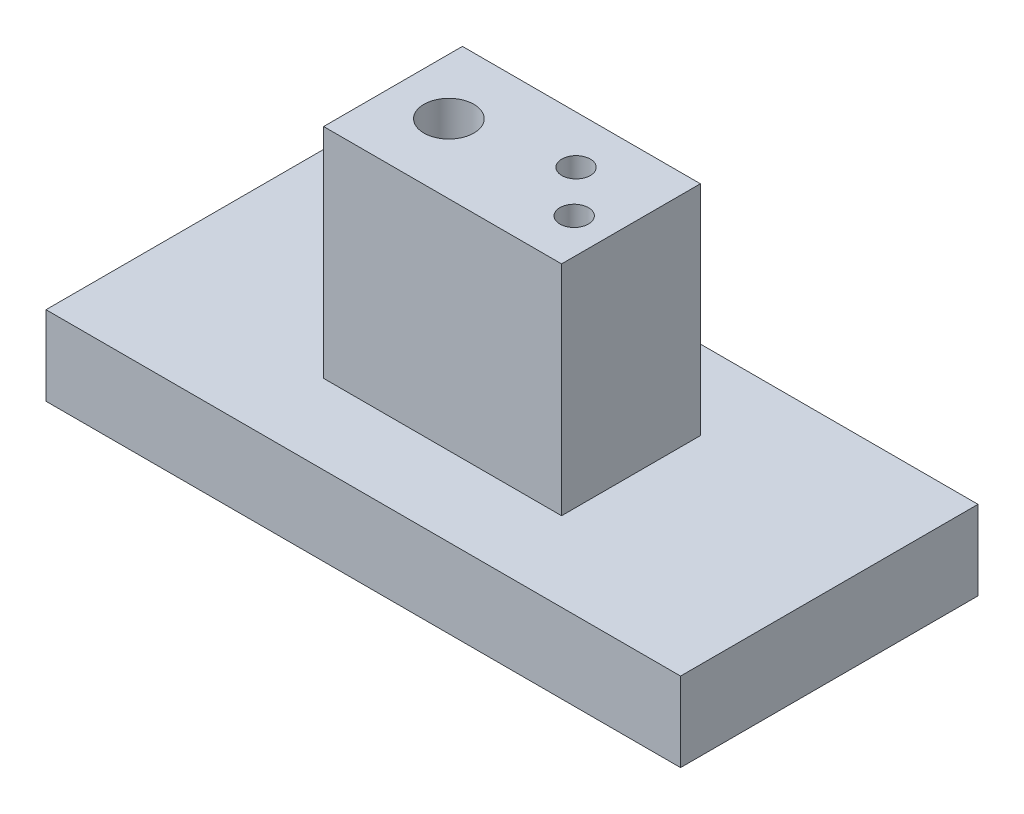
ISO-10303-21;
HEADER;
FILE_DESCRIPTION(('STEP AP214'),'2;1');
FILE_NAME('part.step','',(''),(''),'','','');
FILE_SCHEMA(('AUTOMOTIVE_DESIGN { 1 0 10303 214 1 1 1 1 }'));
ENDSEC;
DATA;
#1=APPLICATION_CONTEXT('core data for automotive mechanical design processes');
#2=APPLICATION_PROTOCOL_DEFINITION('international standard','automotive_design',2000,#1);
#3=PRODUCT_CONTEXT('',#1,'mechanical');
#4=PRODUCT('Part','Part','',(#3));
#5=PRODUCT_RELATED_PRODUCT_CATEGORY('part','',(#4));
#6=PRODUCT_DEFINITION_FORMATION('','',#4);
#7=PRODUCT_DEFINITION_CONTEXT('part definition',#1,'design');
#8=PRODUCT_DEFINITION('design','',#6,#7);
#9=PRODUCT_DEFINITION_SHAPE('','',#8);
#10=(LENGTH_UNIT() NAMED_UNIT(*) SI_UNIT(.MILLI.,.METRE.));
#11=(NAMED_UNIT(*) PLANE_ANGLE_UNIT() SI_UNIT($,.RADIAN.));
#12=(NAMED_UNIT(*) SI_UNIT($,.STERADIAN.) SOLID_ANGLE_UNIT());
#13=UNCERTAINTY_MEASURE_WITH_UNIT(LENGTH_MEASURE(1.E-05),#10,'distance_accuracy_value','');
#14=(GEOMETRIC_REPRESENTATION_CONTEXT(3) GLOBAL_UNCERTAINTY_ASSIGNED_CONTEXT((#13)) GLOBAL_UNIT_ASSIGNED_CONTEXT((#10,
#11,#12)) REPRESENTATION_CONTEXT('',''));
#15=CARTESIAN_POINT('',(0.,0.,0.));
#16=DIRECTION('',(0.,0.,1.));
#17=DIRECTION('',(1.,0.,0.));
#18=AXIS2_PLACEMENT_3D('',#15,#16,#17);
#19=CARTESIAN_POINT('',(0.,5.5,0.));
#20=DIRECTION('',(0.,-1.,0.));
#21=DIRECTION('',(0.,0.,-1.));
#22=AXIS2_PLACEMENT_3D('',#19,#20,#21);
#23=PLANE('',#22);
#24=DIRECTION('',(0.,0.,1.));
#25=VECTOR('',#24,1.);
#26=CARTESIAN_POINT('',(-3.,5.5,1.75));
#27=LINE('',#26,#25);
#28=CARTESIAN_POINT('',(-3.,5.5,-1.75));
#29=VERTEX_POINT('',#28);
#30=CARTESIAN_POINT('',(-3.,5.5,1.75));
#31=VERTEX_POINT('',#30);
#32=EDGE_CURVE('E141',#29,#31,#27,.T.);
#33=ORIENTED_EDGE('',*,*,#32,.T.);
#34=DIRECTION('',(1.,0.,0.));
#35=VECTOR('',#34,1.);
#36=CARTESIAN_POINT('',(-3.,5.5,1.75));
#37=LINE('',#36,#35);
#38=CARTESIAN_POINT('',(3.,5.5,1.75));
#39=VERTEX_POINT('',#38);
#40=EDGE_CURVE('E143',#31,#39,#37,.T.);
#41=ORIENTED_EDGE('',*,*,#40,.T.);
#42=DIRECTION('',(0.,0.,-1.));
#43=VECTOR('',#42,1.);
#44=CARTESIAN_POINT('',(3.,5.5,1.75));
#45=LINE('',#44,#43);
#46=CARTESIAN_POINT('',(3.,5.5,-1.75));
#47=VERTEX_POINT('',#46);
#48=EDGE_CURVE('E146',#39,#47,#45,.T.);
#49=ORIENTED_EDGE('',*,*,#48,.T.);
#50=DIRECTION('',(-1.,0.,0.));
#51=VECTOR('',#50,1.);
#52=CARTESIAN_POINT('',(-3.,5.5,-1.75));
#53=LINE('',#52,#51);
#54=EDGE_CURVE('E49',#47,#29,#53,.T.);
#55=ORIENTED_EDGE('',*,*,#54,.T.);
#56=EDGE_LOOP('',(#33,#41,#49,#55));
#57=FACE_BOUND('',#56,.T.);
#58=CARTESIAN_POINT('',(1.07296606180843,5.5,-0.541981392860775));
#59=DIRECTION('',(0.,1.,0.));
#60=DIRECTION('',(0.,0.,1.));
#61=AXIS2_PLACEMENT_3D('',#58,#59,#60);
#62=CIRCLE('',#61,0.36);
#63=CARTESIAN_POINT('',(1.07296606180843,5.5,-0.181981392860775));
#64=VERTEX_POINT('',#63);
#65=EDGE_CURVE('E135',#64,#64,#62,.T.);
#66=ORIENTED_EDGE('',*,*,#65,.F.);
#67=EDGE_LOOP('',(#66));
#68=FACE_BOUND('',#67,.T.);
#69=CARTESIAN_POINT('',(2.10980003075948,5.5,0.541981392860773));
#70=DIRECTION('',(0.,1.,0.));
#71=DIRECTION('',(0.,0.,1.));
#72=AXIS2_PLACEMENT_3D('',#69,#70,#71);
#73=CIRCLE('',#72,0.36);
#74=CARTESIAN_POINT('',(2.10980003075948,5.5,0.901981392860773));
#75=VERTEX_POINT('',#74);
#76=EDGE_CURVE('E129',#75,#75,#73,.T.);
#77=ORIENTED_EDGE('',*,*,#76,.F.);
#78=EDGE_LOOP('',(#77));
#79=FACE_BOUND('',#78,.T.);
#80=CARTESIAN_POINT('',(-1.59138304628396,5.5,0.));
#81=DIRECTION('',(0.,1.,0.));
#82=DIRECTION('',(0.,0.,1.));
#83=AXIS2_PLACEMENT_3D('',#80,#81,#82);
#84=CIRCLE('',#83,0.63);
#85=CARTESIAN_POINT('',(-1.59138304628396,5.5,0.63));
#86=VERTEX_POINT('',#85);
#87=EDGE_CURVE('E120',#86,#86,#84,.T.);
#88=ORIENTED_EDGE('',*,*,#87,.F.);
#89=EDGE_LOOP('',(#88));
#90=FACE_BOUND('',#89,.T.);
#91=ADVANCED_FACE('F33',(#57,#68,#79,#90),#23,.F.);
#92=CARTESIAN_POINT('',(-3.,5.5,1.75));
#93=DIRECTION('',(1.,0.,0.));
#94=DIRECTION('',(0.,0.,-1.));
#95=AXIS2_PLACEMENT_3D('',#92,#93,#94);
#96=PLANE('',#95);
#97=DIRECTION('',(0.,0.,1.));
#98=VECTOR('',#97,1.);
#99=CARTESIAN_POINT('',(-3.,0.,1.75));
#100=LINE('',#99,#98);
#101=CARTESIAN_POINT('',(-3.,0.,-1.75));
#102=VERTEX_POINT('',#101);
#103=CARTESIAN_POINT('',(-3.,0.,1.75));
#104=VERTEX_POINT('',#103);
#105=EDGE_CURVE('E138',#102,#104,#100,.T.);
#106=ORIENTED_EDGE('',*,*,#105,.T.);
#107=DIRECTION('',(0.,-1.,0.));
#108=VECTOR('',#107,1.);
#109=CARTESIAN_POINT('',(-3.,5.5,1.75));
#110=LINE('',#109,#108);
#111=EDGE_CURVE('E42',#31,#104,#110,.T.);
#112=ORIENTED_EDGE('',*,*,#111,.F.);
#113=ORIENTED_EDGE('',*,*,#32,.F.);
#114=DIRECTION('',(0.,-1.,0.));
#115=VECTOR('',#114,1.);
#116=CARTESIAN_POINT('',(-3.,5.5,-1.75));
#117=LINE('',#116,#115);
#118=EDGE_CURVE('E149',#29,#102,#117,.T.);
#119=ORIENTED_EDGE('',*,*,#118,.T.);
#120=EDGE_LOOP('',(#106,#112,#113,#119));
#121=FACE_BOUND('',#120,.T.);
#122=ADVANCED_FACE('F35',(#121),#96,.F.);
#123=CARTESIAN_POINT('',(-3.,5.5,1.75));
#124=DIRECTION('',(0.,0.,-1.));
#125=DIRECTION('',(-1.,0.,0.));
#126=AXIS2_PLACEMENT_3D('',#123,#124,#125);
#127=PLANE('',#126);
#128=DIRECTION('',(1.,0.,0.));
#129=VECTOR('',#128,1.);
#130=CARTESIAN_POINT('',(-3.,0.,1.75));
#131=LINE('',#130,#129);
#132=CARTESIAN_POINT('',(3.,0.,1.75));
#133=VERTEX_POINT('',#132);
#134=EDGE_CURVE('E152',#104,#133,#131,.T.);
#135=ORIENTED_EDGE('',*,*,#134,.T.);
#136=DIRECTION('',(0.,-1.,0.));
#137=VECTOR('',#136,1.);
#138=CARTESIAN_POINT('',(3.,5.5,1.75));
#139=LINE('',#138,#137);
#140=EDGE_CURVE('E165',#39,#133,#139,.T.);
#141=ORIENTED_EDGE('',*,*,#140,.F.);
#142=ORIENTED_EDGE('',*,*,#40,.F.);
#143=ORIENTED_EDGE('',*,*,#111,.T.);
#144=EDGE_LOOP('',(#135,#141,#142,#143));
#145=FACE_BOUND('',#144,.T.);
#146=ADVANCED_FACE('F170',(#145),#127,.F.);
#147=CARTESIAN_POINT('',(3.,5.5,1.75));
#148=DIRECTION('',(-1.,0.,0.));
#149=DIRECTION('',(0.,0.,1.));
#150=AXIS2_PLACEMENT_3D('',#147,#148,#149);
#151=PLANE('',#150);
#152=DIRECTION('',(0.,0.,-1.));
#153=VECTOR('',#152,1.);
#154=CARTESIAN_POINT('',(3.,0.,1.75));
#155=LINE('',#154,#153);
#156=CARTESIAN_POINT('',(3.,0.,-1.75));
#157=VERTEX_POINT('',#156);
#158=EDGE_CURVE('E155',#133,#157,#155,.T.);
#159=ORIENTED_EDGE('',*,*,#158,.T.);
#160=DIRECTION('',(0.,-1.,0.));
#161=VECTOR('',#160,1.);
#162=CARTESIAN_POINT('',(3.,5.5,-1.75));
#163=LINE('',#162,#161);
#164=EDGE_CURVE('E162',#47,#157,#163,.T.);
#165=ORIENTED_EDGE('',*,*,#164,.F.);
#166=ORIENTED_EDGE('',*,*,#48,.F.);
#167=ORIENTED_EDGE('',*,*,#140,.T.);
#168=EDGE_LOOP('',(#159,#165,#166,#167));
#169=FACE_BOUND('',#168,.T.);
#170=ADVANCED_FACE('F183',(#169),#151,.F.);
#171=CARTESIAN_POINT('',(-3.,5.5,-1.75));
#172=DIRECTION('',(0.,0.,1.));
#173=DIRECTION('',(1.,0.,0.));
#174=AXIS2_PLACEMENT_3D('',#171,#172,#173);
#175=PLANE('',#174);
#176=DIRECTION('',(-1.,0.,0.));
#177=VECTOR('',#176,1.);
#178=CARTESIAN_POINT('',(-3.,0.,-1.75));
#179=LINE('',#178,#177);
#180=EDGE_CURVE('E144',#157,#102,#179,.T.);
#181=ORIENTED_EDGE('',*,*,#180,.T.);
#182=ORIENTED_EDGE('',*,*,#118,.F.);
#183=ORIENTED_EDGE('',*,*,#54,.F.);
#184=ORIENTED_EDGE('',*,*,#164,.T.);
#185=EDGE_LOOP('',(#181,#182,#183,#184));
#186=FACE_BOUND('',#185,.T.);
#187=ADVANCED_FACE('F179',(#186),#175,.F.);
#188=CARTESIAN_POINT('',(1.07296606180843,5.5,-0.541981392860775));
#189=DIRECTION('',(0.,-1.,0.));
#190=DIRECTION('',(0.,0.,-1.));
#191=AXIS2_PLACEMENT_3D('',#188,#189,#190);
#192=CYLINDRICAL_SURFACE('',#191,0.36);
#193=ORIENTED_EDGE('',*,*,#65,.T.);
#194=EDGE_LOOP('',(#193));
#195=FACE_BOUND('',#194,.T.);
#196=CARTESIAN_POINT('',(1.07296606180843,0.,-0.541981392860775));
#197=DIRECTION('',(0.,1.,0.));
#198=DIRECTION('',(0.,0.,1.));
#199=AXIS2_PLACEMENT_3D('',#196,#197,#198);
#200=CIRCLE('',#199,0.36);
#201=CARTESIAN_POINT('',(1.07296606180843,0.,-0.181981392860775));
#202=VERTEX_POINT('',#201);
#203=EDGE_CURVE('E132',#202,#202,#200,.T.);
#204=ORIENTED_EDGE('',*,*,#203,.F.);
#205=EDGE_LOOP('',(#204));
#206=FACE_BOUND('',#205,.T.);
#207=ADVANCED_FACE('F206',(#195,#206),#192,.F.);
#208=CARTESIAN_POINT('',(2.10980003075948,5.5,0.541981392860773));
#209=DIRECTION('',(0.,-1.,0.));
#210=DIRECTION('',(0.,0.,-1.));
#211=AXIS2_PLACEMENT_3D('',#208,#209,#210);
#212=CYLINDRICAL_SURFACE('',#211,0.36);
#213=ORIENTED_EDGE('',*,*,#76,.T.);
#214=EDGE_LOOP('',(#213));
#215=FACE_BOUND('',#214,.T.);
#216=CARTESIAN_POINT('',(2.10980003075948,0.,0.541981392860773));
#217=DIRECTION('',(0.,1.,0.));
#218=DIRECTION('',(0.,0.,1.));
#219=AXIS2_PLACEMENT_3D('',#216,#217,#218);
#220=CIRCLE('',#219,0.36);
#221=CARTESIAN_POINT('',(2.10980003075948,0.,0.901981392860773));
#222=VERTEX_POINT('',#221);
#223=EDGE_CURVE('E123',#222,#222,#220,.T.);
#224=ORIENTED_EDGE('',*,*,#223,.F.);
#225=EDGE_LOOP('',(#224));
#226=FACE_BOUND('',#225,.T.);
#227=ADVANCED_FACE('F196',(#215,#226),#212,.F.);
#228=CARTESIAN_POINT('',(-1.59138304628396,5.5,0.));
#229=DIRECTION('',(0.,-1.,0.));
#230=DIRECTION('',(0.,0.,-1.));
#231=AXIS2_PLACEMENT_3D('',#228,#229,#230);
#232=CYLINDRICAL_SURFACE('',#231,0.63);
#233=CARTESIAN_POINT('',(-1.59138304628396,0.2,0.));
#234=DIRECTION('',(0.,1.,0.));
#235=DIRECTION('',(0.,0.,1.));
#236=AXIS2_PLACEMENT_3D('',#233,#234,#235);
#237=CIRCLE('',#236,0.63);
#238=CARTESIAN_POINT('',(-1.59138304628396,0.2,0.63));
#239=VERTEX_POINT('',#238);
#240=EDGE_CURVE('E11',#239,#239,#237,.T.);
#241=ORIENTED_EDGE('',*,*,#240,.F.);
#242=EDGE_LOOP('',(#241));
#243=FACE_BOUND('',#242,.T.);
#244=ORIENTED_EDGE('',*,*,#87,.T.);
#245=EDGE_LOOP('',(#244));
#246=FACE_BOUND('',#245,.T.);
#247=ADVANCED_FACE('F193',(#243,#246),#232,.F.);
#248=CARTESIAN_POINT('',(0.,0.,0.));
#249=DIRECTION('',(0.,-1.,0.));
#250=DIRECTION('',(0.,0.,-1.));
#251=AXIS2_PLACEMENT_3D('',#248,#249,#250);
#252=PLANE('',#251);
#253=CARTESIAN_POINT('',(2.10980003075948,0.,0.541981392860773));
#254=DIRECTION('',(0.,-1.,0.));
#255=DIRECTION('',(0.,0.,-1.));
#256=AXIS2_PLACEMENT_3D('',#253,#254,#255);
#257=CIRCLE('',#256,0.25);
#258=CARTESIAN_POINT('',(2.10980003075948,0.,0.291981392860773));
#259=VERTEX_POINT('',#258);
#260=EDGE_CURVE('E372',#259,#259,#257,.T.);
#261=ORIENTED_EDGE('',*,*,#260,.T.);
#262=EDGE_LOOP('',(#261));
#263=FACE_BOUND('',#262,.T.);
#264=ORIENTED_EDGE('',*,*,#223,.T.);
#265=EDGE_LOOP('',(#264));
#266=FACE_BOUND('',#265,.T.);
#267=ADVANCED_FACE('F195',(#263,#266),#252,.F.);
#268=CARTESIAN_POINT('',(1.07296606180843,0.,-0.541981392860775));
#269=DIRECTION('',(0.,-1.,0.));
#270=DIRECTION('',(0.,0.,-1.));
#271=AXIS2_PLACEMENT_3D('',#268,#269,#270);
#272=CIRCLE('',#271,0.25);
#273=CARTESIAN_POINT('',(1.07296606180843,0.,-0.791981392860775));
#274=VERTEX_POINT('',#273);
#275=EDGE_CURVE('E366',#274,#274,#272,.T.);
#276=ORIENTED_EDGE('',*,*,#275,.T.);
#277=EDGE_LOOP('',(#276));
#278=FACE_BOUND('',#277,.T.);
#279=ORIENTED_EDGE('',*,*,#203,.T.);
#280=EDGE_LOOP('',(#279));
#281=FACE_BOUND('',#280,.T.);
#282=ADVANCED_FACE('F203',(#278,#281),#252,.F.);
#283=CARTESIAN_POINT('',(0.,-2.,0.));
#284=DIRECTION('',(0.,-1.,0.));
#285=DIRECTION('',(0.,0.,-1.));
#286=AXIS2_PLACEMENT_3D('',#283,#284,#285);
#287=PLANE('',#286);
#288=CARTESIAN_POINT('',(1.07296606180843,-2.,-0.541981392860775));
#289=DIRECTION('',(0.,-1.,0.));
#290=DIRECTION('',(0.,0.,-1.));
#291=AXIS2_PLACEMENT_3D('',#288,#289,#290);
#292=CIRCLE('',#291,0.25);
#293=CARTESIAN_POINT('',(1.07296606180843,-2.,-0.791981392860775));
#294=VERTEX_POINT('',#293);
#295=EDGE_CURVE('E369',#294,#294,#292,.T.);
#296=ORIENTED_EDGE('',*,*,#295,.F.);
#297=EDGE_LOOP('',(#296));
#298=FACE_BOUND('',#297,.T.);
#299=DIRECTION('',(0.,0.,-1.));
#300=VECTOR('',#299,1.);
#301=CARTESIAN_POINT('',(-8.,-2.,3.75));
#302=LINE('',#301,#300);
#303=CARTESIAN_POINT('',(-8.,-2.,3.75));
#304=VERTEX_POINT('',#303);
#305=CARTESIAN_POINT('',(-8.,-2.,-3.75));
#306=VERTEX_POINT('',#305);
#307=EDGE_CURVE('E105',#304,#306,#302,.T.);
#308=ORIENTED_EDGE('',*,*,#307,.T.);
#309=DIRECTION('',(1.,0.,0.));
#310=VECTOR('',#309,1.);
#311=CARTESIAN_POINT('',(-8.,-2.,-3.75));
#312=LINE('',#311,#310);
#313=CARTESIAN_POINT('',(8.,-2.,-3.75));
#314=VERTEX_POINT('',#313);
#315=EDGE_CURVE('E94',#306,#314,#312,.T.);
#316=ORIENTED_EDGE('',*,*,#315,.T.);
#317=DIRECTION('',(0.,0.,1.));
#318=VECTOR('',#317,1.);
#319=CARTESIAN_POINT('',(8.,-2.,3.75));
#320=LINE('',#319,#318);
#321=CARTESIAN_POINT('',(8.,-2.,3.75));
#322=VERTEX_POINT('',#321);
#323=EDGE_CURVE('E104',#314,#322,#320,.T.);
#324=ORIENTED_EDGE('',*,*,#323,.T.);
#325=DIRECTION('',(-1.,0.,0.));
#326=VECTOR('',#325,1.);
#327=CARTESIAN_POINT('',(-8.,-2.,3.75));
#328=LINE('',#327,#326);
#329=EDGE_CURVE('E111',#322,#304,#328,.T.);
#330=ORIENTED_EDGE('',*,*,#329,.T.);
#331=EDGE_LOOP('',(#308,#316,#324,#330));
#332=FACE_BOUND('',#331,.T.);
#333=CARTESIAN_POINT('',(2.10980003075948,-2.,0.541981392860773));
#334=DIRECTION('',(0.,-1.,0.));
#335=DIRECTION('',(0.,0.,-1.));
#336=AXIS2_PLACEMENT_3D('',#333,#334,#335);
#337=CIRCLE('',#336,0.25);
#338=CARTESIAN_POINT('',(2.10980003075948,-2.,0.291981392860773));
#339=VERTEX_POINT('',#338);
#340=EDGE_CURVE('E375',#339,#339,#337,.T.);
#341=ORIENTED_EDGE('',*,*,#340,.F.);
#342=EDGE_LOOP('',(#341));
#343=FACE_BOUND('',#342,.T.);
#344=CARTESIAN_POINT('',(-1.59138304628396,-2.,0.));
#345=DIRECTION('',(0.,-1.,0.));
#346=DIRECTION('',(0.,0.,-1.));
#347=AXIS2_PLACEMENT_3D('',#344,#345,#346);
#348=CIRCLE('',#347,0.25);
#349=CARTESIAN_POINT('',(-1.59138304628396,-2.,-0.25));
#350=VERTEX_POINT('',#349);
#351=EDGE_CURVE('E363',#350,#350,#348,.T.);
#352=ORIENTED_EDGE('',*,*,#351,.F.);
#353=EDGE_LOOP('',(#352));
#354=FACE_BOUND('',#353,.T.);
#355=ADVANCED_FACE('F108',(#298,#332,#343,#354),#287,.T.);
#356=ORIENTED_EDGE('',*,*,#105,.F.);
#357=ORIENTED_EDGE('',*,*,#180,.F.);
#358=ORIENTED_EDGE('',*,*,#158,.F.);
#359=ORIENTED_EDGE('',*,*,#134,.F.);
#360=EDGE_LOOP('',(#356,#357,#358,#359));
#361=FACE_BOUND('',#360,.T.);
#362=DIRECTION('',(0.,0.,-1.));
#363=VECTOR('',#362,1.);
#364=CARTESIAN_POINT('',(-8.,0.,3.75));
#365=LINE('',#364,#363);
#366=CARTESIAN_POINT('',(-8.,0.,3.75));
#367=VERTEX_POINT('',#366);
#368=CARTESIAN_POINT('',(-8.,0.,-3.75));
#369=VERTEX_POINT('',#368);
#370=EDGE_CURVE('E119',#367,#369,#365,.T.);
#371=ORIENTED_EDGE('',*,*,#370,.F.);
#372=DIRECTION('',(-1.,0.,0.));
#373=VECTOR('',#372,1.);
#374=CARTESIAN_POINT('',(-8.,0.,3.75));
#375=LINE('',#374,#373);
#376=CARTESIAN_POINT('',(8.,0.,3.75));
#377=VERTEX_POINT('',#376);
#378=EDGE_CURVE('E115',#377,#367,#375,.T.);
#379=ORIENTED_EDGE('',*,*,#378,.F.);
#380=DIRECTION('',(0.,0.,1.));
#381=VECTOR('',#380,1.);
#382=CARTESIAN_POINT('',(8.,0.,3.75));
#383=LINE('',#382,#381);
#384=CARTESIAN_POINT('',(8.,0.,-3.75));
#385=VERTEX_POINT('',#384);
#386=EDGE_CURVE('E386',#385,#377,#383,.T.);
#387=ORIENTED_EDGE('',*,*,#386,.F.);
#388=DIRECTION('',(1.,0.,0.));
#389=VECTOR('',#388,1.);
#390=CARTESIAN_POINT('',(-8.,0.,-3.75));
#391=LINE('',#390,#389);
#392=EDGE_CURVE('E384',#369,#385,#391,.T.);
#393=ORIENTED_EDGE('',*,*,#392,.F.);
#394=EDGE_LOOP('',(#371,#379,#387,#393));
#395=FACE_BOUND('',#394,.T.);
#396=ADVANCED_FACE('F175',(#361,#395),#252,.F.);
#397=CARTESIAN_POINT('',(-8.,-2.,3.75));
#398=DIRECTION('',(1.,0.,0.));
#399=DIRECTION('',(0.,0.,-1.));
#400=AXIS2_PLACEMENT_3D('',#397,#398,#399);
#401=PLANE('',#400);
#402=ORIENTED_EDGE('',*,*,#370,.T.);
#403=DIRECTION('',(0.,1.,0.));
#404=VECTOR('',#403,1.);
#405=CARTESIAN_POINT('',(-8.,-2.,-3.75));
#406=LINE('',#405,#404);
#407=EDGE_CURVE('E98',#306,#369,#406,.T.);
#408=ORIENTED_EDGE('',*,*,#407,.F.);
#409=ORIENTED_EDGE('',*,*,#307,.F.);
#410=DIRECTION('',(0.,1.,0.));
#411=VECTOR('',#410,1.);
#412=CARTESIAN_POINT('',(-8.,-2.,3.75));
#413=LINE('',#412,#411);
#414=EDGE_CURVE('E382',#304,#367,#413,.T.);
#415=ORIENTED_EDGE('',*,*,#414,.T.);
#416=EDGE_LOOP('',(#402,#408,#409,#415));
#417=FACE_BOUND('',#416,.T.);
#418=ADVANCED_FACE('F117',(#417),#401,.F.);
#419=CARTESIAN_POINT('',(-8.,-2.,-3.75));
#420=DIRECTION('',(0.,0.,1.));
#421=DIRECTION('',(1.,0.,0.));
#422=AXIS2_PLACEMENT_3D('',#419,#420,#421);
#423=PLANE('',#422);
#424=ORIENTED_EDGE('',*,*,#392,.T.);
#425=DIRECTION('',(0.,1.,0.));
#426=VECTOR('',#425,1.);
#427=CARTESIAN_POINT('',(8.,-2.,-3.75));
#428=LINE('',#427,#426);
#429=EDGE_CURVE('E101',#314,#385,#428,.T.);
#430=ORIENTED_EDGE('',*,*,#429,.F.);
#431=ORIENTED_EDGE('',*,*,#315,.F.);
#432=ORIENTED_EDGE('',*,*,#407,.T.);
#433=EDGE_LOOP('',(#424,#430,#431,#432));
#434=FACE_BOUND('',#433,.T.);
#435=ADVANCED_FACE('F96',(#434),#423,.F.);
#436=CARTESIAN_POINT('',(8.,-2.,3.75));
#437=DIRECTION('',(-1.,0.,0.));
#438=DIRECTION('',(0.,0.,1.));
#439=AXIS2_PLACEMENT_3D('',#436,#437,#438);
#440=PLANE('',#439);
#441=ORIENTED_EDGE('',*,*,#386,.T.);
#442=DIRECTION('',(0.,1.,0.));
#443=VECTOR('',#442,1.);
#444=CARTESIAN_POINT('',(8.,-2.,3.75));
#445=LINE('',#444,#443);
#446=EDGE_CURVE('E125',#322,#377,#445,.T.);
#447=ORIENTED_EDGE('',*,*,#446,.F.);
#448=ORIENTED_EDGE('',*,*,#323,.F.);
#449=ORIENTED_EDGE('',*,*,#429,.T.);
#450=EDGE_LOOP('',(#441,#447,#448,#449));
#451=FACE_BOUND('',#450,.T.);
#452=ADVANCED_FACE('F291',(#451),#440,.F.);
#453=CARTESIAN_POINT('',(-8.,-2.,3.75));
#454=DIRECTION('',(0.,0.,-1.));
#455=DIRECTION('',(-1.,0.,0.));
#456=AXIS2_PLACEMENT_3D('',#453,#454,#455);
#457=PLANE('',#456);
#458=ORIENTED_EDGE('',*,*,#378,.T.);
#459=ORIENTED_EDGE('',*,*,#414,.F.);
#460=ORIENTED_EDGE('',*,*,#329,.F.);
#461=ORIENTED_EDGE('',*,*,#446,.T.);
#462=EDGE_LOOP('',(#458,#459,#460,#461));
#463=FACE_BOUND('',#462,.T.);
#464=ADVANCED_FACE('F298',(#463),#457,.F.);
#465=CARTESIAN_POINT('',(2.10980003075948,-2.,0.541981392860773));
#466=DIRECTION('',(0.,1.,0.));
#467=DIRECTION('',(0.,0.,1.));
#468=AXIS2_PLACEMENT_3D('',#465,#466,#467);
#469=CYLINDRICAL_SURFACE('',#468,0.25);
#470=ORIENTED_EDGE('',*,*,#340,.T.);
#471=EDGE_LOOP('',(#470));
#472=FACE_BOUND('',#471,.T.);
#473=ORIENTED_EDGE('',*,*,#260,.F.);
#474=EDGE_LOOP('',(#473));
#475=FACE_BOUND('',#474,.T.);
#476=ADVANCED_FACE('F307',(#472,#475),#469,.F.);
#477=CARTESIAN_POINT('',(1.07296606180843,-2.,-0.541981392860775));
#478=DIRECTION('',(0.,1.,0.));
#479=DIRECTION('',(0.,0.,1.));
#480=AXIS2_PLACEMENT_3D('',#477,#478,#479);
#481=CYLINDRICAL_SURFACE('',#480,0.25);
#482=ORIENTED_EDGE('',*,*,#295,.T.);
#483=EDGE_LOOP('',(#482));
#484=FACE_BOUND('',#483,.T.);
#485=ORIENTED_EDGE('',*,*,#275,.F.);
#486=EDGE_LOOP('',(#485));
#487=FACE_BOUND('',#486,.T.);
#488=ADVANCED_FACE('F316',(#484,#487),#481,.F.);
#489=CARTESIAN_POINT('',(-1.59138304628396,-2.,0.));
#490=DIRECTION('',(0.,1.,0.));
#491=DIRECTION('',(0.,0.,1.));
#492=AXIS2_PLACEMENT_3D('',#489,#490,#491);
#493=CYLINDRICAL_SURFACE('',#492,0.25);
#494=ORIENTED_EDGE('',*,*,#351,.T.);
#495=EDGE_LOOP('',(#494));
#496=FACE_BOUND('',#495,.T.);
#497=CARTESIAN_POINT('',(-1.59138304628396,0.2,0.));
#498=DIRECTION('',(0.,1.,0.));
#499=DIRECTION('',(0.,0.,1.));
#500=AXIS2_PLACEMENT_3D('',#497,#498,#499);
#501=CIRCLE('',#500,0.25);
#502=CARTESIAN_POINT('',(-1.59138304628396,0.2,0.25));
#503=VERTEX_POINT('',#502);
#504=EDGE_CURVE('E361',#503,#503,#501,.T.);
#505=ORIENTED_EDGE('',*,*,#504,.T.);
#506=EDGE_LOOP('',(#505));
#507=FACE_BOUND('',#506,.T.);
#508=ADVANCED_FACE('F324',(#496,#507),#493,.F.);
#509=CARTESIAN_POINT('',(-1.59138304628396,0.2,0.));
#510=DIRECTION('',(0.,1.,0.));
#511=DIRECTION('',(0.,0.,1.));
#512=AXIS2_PLACEMENT_3D('',#509,#510,#511);
#513=PLANE('',#512);
#514=ORIENTED_EDGE('',*,*,#240,.T.);
#515=EDGE_LOOP('',(#514));
#516=FACE_BOUND('',#515,.T.);
#517=ORIENTED_EDGE('',*,*,#504,.F.);
#518=EDGE_LOOP('',(#517));
#519=FACE_BOUND('',#518,.T.);
#520=ADVANCED_FACE('F332',(#516,#519),#513,.T.);
#521=CLOSED_SHELL('',(#91,#122,#146,#170,#187,#207,#227,#247,#267,#282,#355,#396,#418,#435,#452,
#464,#476,#488,#508,#520));
#522=MANIFOLD_SOLID_BREP('B2',#521);
#523=ADVANCED_BREP_SHAPE_REPRESENTATION('',(#18,#522),#14);
#524=SHAPE_DEFINITION_REPRESENTATION(#9,#523);
ENDSEC;
END-ISO-10303-21;
